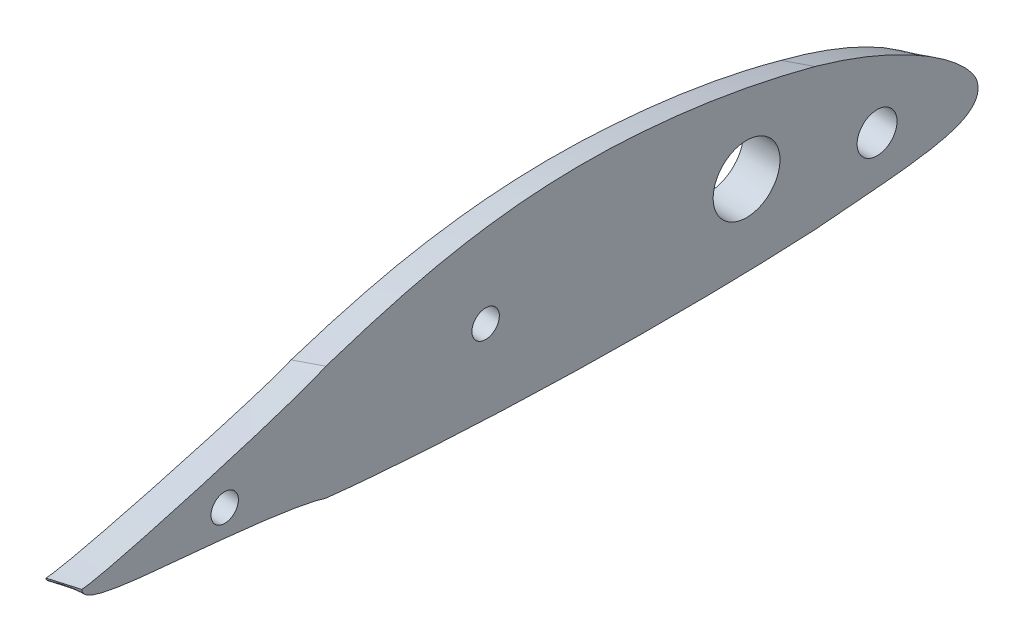
ISO-10303-21;
HEADER;
FILE_DESCRIPTION(('STEP AP214'),'2;1');
FILE_NAME('part.step','',(''),(''),'','','');
FILE_SCHEMA(('AUTOMOTIVE_DESIGN { 1 0 10303 214 1 1 1 1 }'));
ENDSEC;
DATA;
#1=APPLICATION_CONTEXT('core data for automotive mechanical design processes');
#2=APPLICATION_PROTOCOL_DEFINITION('international standard','automotive_design',2000,#1);
#3=PRODUCT_CONTEXT('',#1,'mechanical');
#4=PRODUCT('Part','Part','',(#3));
#5=PRODUCT_RELATED_PRODUCT_CATEGORY('part','',(#4));
#6=PRODUCT_DEFINITION_FORMATION('','',#4);
#7=PRODUCT_DEFINITION_CONTEXT('part definition',#1,'design');
#8=PRODUCT_DEFINITION('design','',#6,#7);
#9=PRODUCT_DEFINITION_SHAPE('','',#8);
#10=(LENGTH_UNIT() NAMED_UNIT(*) SI_UNIT(.MILLI.,.METRE.));
#11=(NAMED_UNIT(*) PLANE_ANGLE_UNIT() SI_UNIT($,.RADIAN.));
#12=(NAMED_UNIT(*) SI_UNIT($,.STERADIAN.) SOLID_ANGLE_UNIT());
#13=UNCERTAINTY_MEASURE_WITH_UNIT(LENGTH_MEASURE(1.E-05),#10,'distance_accuracy_value','');
#14=(GEOMETRIC_REPRESENTATION_CONTEXT(3) GLOBAL_UNCERTAINTY_ASSIGNED_CONTEXT((#13)) GLOBAL_UNIT_ASSIGNED_CONTEXT((#10,
#11,#12)) REPRESENTATION_CONTEXT('',''));
#15=CARTESIAN_POINT('',(0.,0.,0.));
#16=DIRECTION('',(0.,0.,1.));
#17=DIRECTION('',(1.,0.,0.));
#18=AXIS2_PLACEMENT_3D('',#15,#16,#17);
#19=CARTESIAN_POINT('',(-25.,-6.87523890885718,62.5215420335683));
#20=DIRECTION('',(1.,0.,0.));
#21=DIRECTION('',(0.,1.,0.));
#22=AXIS2_PLACEMENT_3D('',#19,#20,#21);
#23=PLANE('',#22);
#24=CARTESIAN_POINT('',(-24.9999999999992,5.5006500499004,35.5100000003707));
#25=DIRECTION('',(1.,0.,0.));
#26=DIRECTION('',(0.,1.,-1.19463882276146E-09));
#27=AXIS2_PLACEMENT_3D('',#24,#25,#26);
#28=ELLIPSE('',#27,5.12702641156756,5.12);
#29=CARTESIAN_POINT('',(-24.9999999999988,10.627676461468,35.5099999942458));
#30=VERTEX_POINT('',#29);
#31=EDGE_CURVE('E482',#30,#30,#28,.T.);
#32=ORIENTED_EDGE('',*,*,#31,.F.);
#33=EDGE_LOOP('',(#32));
#34=FACE_BOUND('',#33,.T.);
#35=CARTESIAN_POINT('',(-24.9999999999996,1.64402232390111,15.5000000003833));
#36=DIRECTION('',(1.,0.,0.));
#37=DIRECTION('',(0.,1.,-1.19463882276146E-09));
#38=AXIS2_PLACEMENT_3D('',#35,#36,#37);
#39=ELLIPSE('',#38,3.06419937878843,3.06);
#40=CARTESIAN_POINT('',(-24.9999999999993,4.70822170268954,15.4999999967227));
#41=VERTEX_POINT('',#40);
#42=EDGE_CURVE('E486',#41,#41,#39,.T.);
#43=ORIENTED_EDGE('',*,*,#42,.F.);
#44=EDGE_LOOP('',(#43));
#45=FACE_BOUND('',#44,.T.);
#46=CARTESIAN_POINT('',(-24.999999999999,6.28985118663691,75.5099999997319));
#47=DIRECTION('',(1.,0.,0.));
#48=DIRECTION('',(0.,1.,-1.19463882276146E-09));
#49=AXIS2_PLACEMENT_3D('',#46,#47,#48);
#50=ELLIPSE('',#49,2.10288192661951,2.1);
#51=CARTESIAN_POINT('',(-24.9999999999988,8.39273311325642,75.5099999972198));
#52=VERTEX_POINT('',#51);
#53=EDGE_CURVE('E490',#52,#52,#50,.T.);
#54=ORIENTED_EDGE('',*,*,#53,.F.);
#55=EDGE_LOOP('',(#54));
#56=FACE_BOUND('',#55,.T.);
#57=CARTESIAN_POINT('',(-24.9999999999992,1.88350126871129,115.509999996588));
#58=DIRECTION('',(1.,0.,0.));
#59=DIRECTION('',(0.,1.,-1.19463882276146E-09));
#60=AXIS2_PLACEMENT_3D('',#57,#58,#59);
#61=ELLIPSE('',#60,2.10288192661951,2.1);
#62=CARTESIAN_POINT('',(-24.999999999999,3.9863831953308,115.509999994075));
#63=VERTEX_POINT('',#62);
#64=EDGE_CURVE('E493',#63,#63,#61,.T.);
#65=ORIENTED_EDGE('',*,*,#64,.F.);
#66=EDGE_LOOP('',(#65));
#67=FACE_BOUND('',#66,.T.);
#68=CARTESIAN_POINT('',(-25.,-6.46727104194618,25.));
#69=CARTESIAN_POINT('',(-25.,-6.59514844057958,27.3335150436203));
#70=CARTESIAN_POINT('',(-25.,-6.76161802996523,31.2464802203529));
#71=CARTESIAN_POINT('',(-25.,-6.9275552680851,36.7458923067943));
#72=CARTESIAN_POINT('',(-25.,-7.01719182140762,42.1938583789044));
#73=CARTESIAN_POINT('',(-25.,-7.0464676153504,47.6734408847487));
#74=CARTESIAN_POINT('',(-25.,-7.03392510715627,56.2754783893999));
#75=CARTESIAN_POINT('',(-25.,-6.83729861053213,64.8634462694053));
#76=CARTESIAN_POINT('',(-25.,-6.43471319589367,75.7992808146063));
#77=CARTESIAN_POINT('',(-25.,-6.00320909266925,83.6044279292734));
#78=CARTESIAN_POINT('',(-25.,-5.40497674782844,92.1925983053741));
#79=CARTESIAN_POINT('',(-25.,-4.98326213169716,96.879208298821));
#80=CARTESIAN_POINT('',(-25.,-4.63536817981115,100.));
#81=B_SPLINE_CURVE_WITH_KNOTS('',3,(#68,#69,#70,#71,#72,#73,#74,#75,#76,#77,#78,#79,#80),
.UNSPECIFIED.,.F.,.F.,(4,1,1,1,1,1,1,1,1,1,4),(0.,0.09375,0.15625,0.21875,0.3125,0.375,0.5625,
0.65625,0.8125,0.875,1.),.UNSPECIFIED.);
#82=CARTESIAN_POINT('',(-25.,-6.46727104194618,25.));
#83=VERTEX_POINT('',#82);
#84=CARTESIAN_POINT('',(-25.,-4.63536817981115,100.));
#85=VERTEX_POINT('',#84);
#86=EDGE_CURVE('E207',#83,#85,#81,.T.);
#87=ORIENTED_EDGE('',*,*,#86,.F.);
#88=CARTESIAN_POINT('',(-25.,0.973605234190688,0.209986371700588));
#89=CARTESIAN_POINT('',(-25.,-5.02445676994703,-1.6030878994067));
#90=CARTESIAN_POINT('',(-25.,-5.12526387130145,10.1105981250928));
#91=CARTESIAN_POINT('',(-25.,-6.46727104194618,25.));
#92=B_SPLINE_CURVE_WITH_KNOTS('',3,(#88,#89,#90,#91),.UNSPECIFIED.,.F.,.F.,(4,4),(0.,1.),.UNSPECIFIED.);
#93=CARTESIAN_POINT('',(-25.,0.973605234190688,0.209986371700588));
#94=VERTEX_POINT('',#93);
#95=EDGE_CURVE('E13',#94,#83,#92,.T.);
#96=ORIENTED_EDGE('',*,*,#95,.F.);
#97=CARTESIAN_POINT('',(-25.,15.1870413329445,25.));
#98=CARTESIAN_POINT('',(-25.,11.2505460282975,10.9514941148119));
#99=CARTESIAN_POINT('',(-25.,4.68854762700634,1.64521557231438));
#100=CARTESIAN_POINT('',(-25.,0.973605234190688,0.209986371700588));
#101=B_SPLINE_CURVE_WITH_KNOTS('',3,(#97,#98,#99,#100),.UNSPECIFIED.,.F.,.F.,(4,4),(0.,1.),.UNSPECIFIED.);
#102=CARTESIAN_POINT('',(-25.,15.1870413329445,25.));
#103=VERTEX_POINT('',#102);
#104=EDGE_CURVE('E156',#103,#94,#101,.T.);
#105=ORIENTED_EDGE('',*,*,#104,.F.);
#106=CARTESIAN_POINT('',(-25.,12.8904914199755,100.));
#107=CARTESIAN_POINT('',(-25.,13.9017198457086,96.9217701257834));
#108=CARTESIAN_POINT('',(-25.,15.3529910442084,92.2723434802091));
#109=CARTESIAN_POINT('',(-25.,17.5611954251861,83.9333529161477));
#110=CARTESIAN_POINT('',(-25.,18.6223359111329,78.4097667119618));
#111=CARTESIAN_POINT('',(-25.,19.4717543578297,72.1307352650264));
#112=CARTESIAN_POINT('',(-25.,20.1811537589977,64.8415809888238));
#113=CARTESIAN_POINT('',(-25.,20.1301122581371,56.8127468678325));
#114=CARTESIAN_POINT('',(-25.,19.6578895305848,50.5374588378752));
#115=CARTESIAN_POINT('',(-25.,19.2942750671242,46.6091887363925));
#116=CARTESIAN_POINT('',(-25.,18.7483182972898,42.1560687549081));
#117=CARTESIAN_POINT('',(-25.,17.8299711544026,36.6680529799144));
#118=CARTESIAN_POINT('',(-25.,16.7438634166486,31.1887225621732));
#119=CARTESIAN_POINT('',(-25.,15.8028667331017,27.3087481175205));
#120=CARTESIAN_POINT('',(-25.,15.1870413329445,25.));
#121=B_SPLINE_CURVE_WITH_KNOTS('',3,(#106,#107,#108,#109,#110,#111,#112,#113,#114,#115,#116,
#117,#118,#119,#120),.UNSPECIFIED.,.F.,.F.,(4,1,1,1,1,1,1,1,1,1,1,1,4),(0.,0.125,0.1875,
0.333569716721123,0.34375,0.4375,0.625,0.666941593847408,0.6875,0.78125,0.84375,0.90625,1.),.UNSPECIFIED.);
#122=CARTESIAN_POINT('',(-25.,12.8904914199755,100.));
#123=VERTEX_POINT('',#122);
#124=EDGE_CURVE('E439',#123,#103,#121,.T.);
#125=ORIENTED_EDGE('',*,*,#124,.F.);
#126=CARTESIAN_POINT('',(-25.,1.96131753405757,137.419360993401));
#127=CARTESIAN_POINT('',(-25.,2.17769518252344,133.342560592737));
#128=CARTESIAN_POINT('',(-25.,10.5653288693064,104.537660694706));
#129=CARTESIAN_POINT('',(-25.,12.8904914199755,100.));
#130=B_SPLINE_CURVE_WITH_KNOTS('',3,(#126,#127,#128,#129),.UNSPECIFIED.,.F.,.F.,(4,4),(0.,1.),.UNSPECIFIED.);
#131=CARTESIAN_POINT('',(-25.,1.96131753405757,137.419360993401));
#132=VERTEX_POINT('',#131);
#133=EDGE_CURVE('E321',#132,#123,#130,.T.);
#134=ORIENTED_EDGE('',*,*,#133,.F.);
#135=CARTESIAN_POINT('',(-25.,-4.63536817981115,100.));
#136=CARTESIAN_POINT('',(-25.,-4.12984221570328,101.448294677224));
#137=CARTESIAN_POINT('',(-25.,-2.96356299158403,107.679495801348));
#138=CARTESIAN_POINT('',(-25.,-1.62946195542815,121.235381181294));
#139=CARTESIAN_POINT('',(-25.,-0.557970232798628,133.508903021512));
#140=CARTESIAN_POINT('',(-25.,0.772229147088015,137.377579987367));
#141=CARTESIAN_POINT('',(-25.,1.96131753405757,137.419360993401));
#142=B_SPLINE_CURVE_WITH_KNOTS('',3,(#135,#136,#137,#138,#139,#140,#141),.UNSPECIFIED.,.F.,.F.,
(4,1,1,1,4),(0.,0.25,0.5,0.75,1.),.UNSPECIFIED.);
#143=EDGE_CURVE('E373',#85,#132,#142,.T.);
#144=ORIENTED_EDGE('',*,*,#143,.F.);
#145=EDGE_LOOP('',(#87,#96,#105,#125,#134,#144));
#146=FACE_BOUND('',#145,.T.);
#147=ADVANCED_FACE('F146',(#34,#45,#56,#67,#146),#23,.T.);
#148=CARTESIAN_POINT('',(-30.9940646990496,-1.37215374510614,118.708278387877));
#149=DIRECTION('',(-0.998629534743233,0.0523359564593458,-6.25186067476628E-11));
#150=DIRECTION('',(-0.0523359564593458,-0.998629534743233,0.));
#151=AXIS2_PLACEMENT_3D('',#148,#149,#150);
#152=PLANE('',#151);
#153=CARTESIAN_POINT('',(-30.618444825927,5.79510026747242,35.510000000019));
#154=DIRECTION('',(-0.998629534743233,0.0523359564593458,-6.25186067476628E-11));
#155=DIRECTION('',(-0.0523359564593458,-0.998629534743233,0.));
#156=AXIS2_PLACEMENT_3D('',#153,#154,#155);
#157=CIRCLE('',#156,5.12);
#158=CARTESIAN_POINT('',(-30.8864049229988,0.682117049587073,35.510000000019));
#159=VERTEX_POINT('',#158);
#160=EDGE_CURVE('E601',#159,#159,#157,.T.);
#161=ORIENTED_EDGE('',*,*,#160,.F.);
#162=EDGE_LOOP('',(#161));
#163=FACE_BOUND('',#162,.T.);
#164=CARTESIAN_POINT('',(-30.8200085103059,1.94903604659932,15.500000000019));
#165=DIRECTION('',(-0.998629534743233,0.0523359564593458,-6.25186067476628E-11));
#166=DIRECTION('',(-0.0523359564593458,-0.998629534743233,0.));
#167=AXIS2_PLACEMENT_3D('',#164,#165,#166);
#168=CIRCLE('',#167,3.06);
#169=CARTESIAN_POINT('',(-30.9801565370715,-1.10677032971498,15.500000000019));
#170=VERTEX_POINT('',#169);
#171=EDGE_CURVE('E602',#170,#170,#168,.T.);
#172=ORIENTED_EDGE('',*,*,#171,.F.);
#173=EDGE_LOOP('',(#172));
#174=FACE_BOUND('',#173,.T.);
#175=CARTESIAN_POINT('',(-30.5771978372381,6.58213974112068,75.5099999993828));
#176=DIRECTION('',(-0.998629534743233,0.0523359564593458,-6.25186067476628E-11));
#177=DIRECTION('',(-0.0523359564593458,-0.998629534743233,0.));
#178=AXIS2_PLACEMENT_3D('',#175,#176,#177);
#179=CIRCLE('',#178,2.1);
#180=CARTESIAN_POINT('',(-30.6871033458028,4.48501771815989,75.5099999993828));
#181=VERTEX_POINT('',#180);
#182=EDGE_CURVE('E591',#181,#181,#179,.T.);
#183=ORIENTED_EDGE('',*,*,#182,.F.);
#184=EDGE_LOOP('',(#183));
#185=FACE_BOUND('',#184,.T.);
#186=CARTESIAN_POINT('',(-30.8074923334552,2.18785904637295,115.509999996224));
#187=DIRECTION('',(-0.998629534743233,0.0523359564593458,-6.25186067476628E-11));
#188=DIRECTION('',(-0.0523359564593458,-0.998629534743233,0.));
#189=AXIS2_PLACEMENT_3D('',#186,#187,#188);
#190=CIRCLE('',#189,2.1);
#191=CARTESIAN_POINT('',(-30.9173978420198,0.0907370234121542,115.509999996224));
#192=VERTEX_POINT('',#191);
#193=EDGE_CURVE('E594',#192,#192,#190,.T.);
#194=ORIENTED_EDGE('',*,*,#193,.F.);
#195=EDGE_LOOP('',(#194));
#196=FACE_BOUND('',#195,.T.);
#197=CARTESIAN_POINT('',(-31.0430922171337,-2.30765453758993,100.));
#198=CARTESIAN_POINT('',(-31.0405888672822,-2.25988777663054,100.387571370376));
#199=CARTESIAN_POINT('',(-31.0385119866042,-2.22025853223121,100.775962419935));
#200=CARTESIAN_POINT('',(-31.034612804975,-2.14585771397358,101.55323382453));
#201=CARTESIAN_POINT('',(-31.0328238002538,-2.11172147003079,101.942205345746));
#202=CARTESIAN_POINT('',(-31.0277548977915,-2.01500104829763,103.109449228744));
#203=CARTESIAN_POINT('',(-31.0247728156235,-1.95809953014157,103.888077041598));
#204=CARTESIAN_POINT('',(-31.0166047235201,-1.8022430460934,106.224871932533));
#205=CARTESIAN_POINT('',(-31.0122264000537,-1.71869965605326,107.783985053902));
#206=CARTESIAN_POINT('',(-31.0015555983983,-1.51508862635474,112.46421069925));
#207=CARTESIAN_POINT('',(-30.9972648556404,-1.43321637391091,115.586080001787));
#208=CARTESIAN_POINT('',(-30.9924646207543,-1.34162243070374,120.269377580922));
#209=CARTESIAN_POINT('',(-30.9912460999377,-1.3183716666778,121.830656945481));
#210=CARTESIAN_POINT('',(-30.9888938329408,-1.2734877350425,124.953255705198));
#211=CARTESIAN_POINT('',(-30.9877497450413,-1.25165723567519,126.514580261228));
#212=CARTESIAN_POINT('',(-30.9848488152157,-1.19630419458495,128.856133164177));
#213=CARTESIAN_POINT('',(-30.9836803499547,-1.17400854838672,129.636527523433));
#214=CARTESIAN_POINT('',(-30.9804898397006,-1.11312998451311,131.196794003637));
#215=CARTESIAN_POINT('',(-30.9785047780215,-1.07525275050715,131.976670930877));
#216=CARTESIAN_POINT('',(-30.9740763386401,-0.990753092312241,133.144754822464));
#217=CARTESIAN_POINT('',(-30.9723496098295,-0.957805143526188,133.533773789068));
#218=CARTESIAN_POINT('',(-30.9679703995469,-0.874244832958121,134.30995257949));
#219=CARTESIAN_POINT('',(-30.9653447538219,-0.824144527732533,134.697344223543));
#220=CARTESIAN_POINT('',(-30.9599479999923,-0.721168329976943,135.27376736968));
#221=CARTESIAN_POINT('',(-30.9579009353132,-0.682108008959784,135.465171861675));
#222=CARTESIAN_POINT('',(-30.9529733893552,-0.588084830937332,135.843918077059));
#223=CARTESIAN_POINT('',(-30.9501052741016,-0.53335793174868,136.03184311131));
#224=CARTESIAN_POINT('',(-30.9427770696627,-0.393527461320893,136.395083969518));
#225=CARTESIAN_POINT('',(-30.9383638609231,-0.309318422264135,136.574153668947));
#226=CARTESIAN_POINT('',(-30.9287325263111,-0.125541610533196,136.803263628492));
#227=CARTESIAN_POINT('',(-30.9250229121406,-0.0547579556999206,136.871643763586));
#228=CARTESIAN_POINT('',(-30.9161452343838,0.114638226466441,136.971573672684));
#229=CARTESIAN_POINT('',(-30.9111027596621,0.210854375510566,136.999166459119));
#230=CARTESIAN_POINT('',(-30.9059320818603,0.309516785006777,137.));
#231=B_SPLINE_CURVE_WITH_KNOTS('',3,(#197,#198,#199,#200,#201,#202,#203,#204,#205,#206,#207,
#208,#209,#210,#211,#212,#213,#214,#215,#216,#217,#218,#219,#220,#221,#222,#223,#224,#225,#226,
#227,#228,#229,#230),.UNSPECIFIED.,.F.,.F.,(4,2,2,2,2,2,2,2,2,2,2,2,2,2,2,2,4),(0.,
0.0312499999999995,0.0624999999999991,0.124999999999999,0.250000000000001,0.500000000000004,
0.625000000000004,0.750000000000005,0.812500000000005,0.875000000000004,0.906250000000004,
0.937500000000003,0.953125000000002,0.968750000000001,0.984374999999999,0.9921875,1.),.UNSPECIFIED.);
#232=CARTESIAN_POINT('',(-31.0430922171337,-2.30765453758993,100.));
#233=VERTEX_POINT('',#232);
#234=CARTESIAN_POINT('',(-30.9059320818603,0.309516785006768,137.));
#235=VERTEX_POINT('',#234);
#236=EDGE_CURVE('E289',#233,#235,#231,.T.);
#237=ORIENTED_EDGE('',*,*,#236,.T.);
#238=CARTESIAN_POINT('',(-30.9059320818603,0.309516785006768,137.));
#239=CARTESIAN_POINT('',(-30.9055368501271,0.317058255456844,136.796608319332));
#240=CARTESIAN_POINT('',(-30.9043057559796,0.340548930824258,136.596440665329));
#241=CARTESIAN_POINT('',(-30.9014926531859,0.39422612904938,136.197458878768));
#242=CARTESIAN_POINT('',(-30.8998336058368,0.425882637920563,135.998941894195));
#243=CARTESIAN_POINT('',(-30.8944844793777,0.527950049914961,135.404825731228));
#244=CARTESIAN_POINT('',(-30.8904204599391,0.605496159532625,135.010668887805));
#245=CARTESIAN_POINT('',(-30.8775924361851,0.850269431795186,133.830651356376));
#246=CARTESIAN_POINT('',(-30.8681676103681,1.03010581978635,133.047339540177));
#247=CARTESIAN_POINT('',(-30.8388545300934,1.58943270613084,130.701410113554));
#248=CARTESIAN_POINT('',(-30.8178634755727,1.98996588314187,129.143572852775));
#249=CARTESIAN_POINT('',(-30.7531377685201,3.22500593594318,124.481867583631));
#250=CARTESIAN_POINT('',(-30.7074997192882,4.09583178419868,121.387728801896));
#251=CARTESIAN_POINT('',(-30.6131804816859,5.89555003435182,115.216167771568));
#252=CARTESIAN_POINT('',(-30.5644926472979,6.82456924981885,112.138782030795));
#253=CARTESIAN_POINT('',(-30.4878047427749,8.28786162677363,107.54278735239));
#254=CARTESIAN_POINT('',(-30.4616586015277,8.78675971787766,106.014270614859));
#255=CARTESIAN_POINT('',(-30.4204658759082,9.57276373998781,103.735527854569));
#256=CARTESIAN_POINT('',(-30.4064161236507,9.84084898122943,102.978155452533));
#257=CARTESIAN_POINT('',(-30.3842197287804,10.2643814226241,101.849866930561));
#258=CARTESIAN_POINT('',(-30.3766359577625,10.4090883929775,101.475051997465));
#259=CARTESIAN_POINT('',(-30.3606868702697,10.7134151093236,100.730835621208));
#260=CARTESIAN_POINT('',(-30.3524890229688,10.8698393531269,100.360274178101));
#261=CARTESIAN_POINT('',(-30.3428060033805,11.0546023722461,100.));
#262=B_SPLINE_CURVE_WITH_KNOTS('',3,(#238,#239,#240,#241,#242,#243,#244,#245,#246,#247,#248,
#249,#250,#251,#252,#253,#254,#255,#256,#257,#258,#259,#260,#261),.UNSPECIFIED.,.F.,.F.,(4,2,2,
2,2,2,2,2,2,2,2,4),(0.,0.015624999999999,0.0312499999999979,0.062499999999998,0.124999999999998,
0.249999999999998,0.499999999999999,0.75,0.875,0.9375,0.96875,1.),.UNSPECIFIED.);
#263=CARTESIAN_POINT('',(-30.3428060033805,11.0546023722461,100.));
#264=VERTEX_POINT('',#263);
#265=EDGE_CURVE('E281',#235,#264,#262,.T.);
#266=ORIENTED_EDGE('',*,*,#265,.T.);
#267=CARTESIAN_POINT('',(-30.3428060033805,11.0546023722461,100.));
#268=CARTESIAN_POINT('',(-30.2868563612065,12.1221851341158,96.9322533281964));
#269=CARTESIAN_POINT('',(-30.2085072298683,13.6171756068156,92.291985137274));
#270=CARTESIAN_POINT('',(-30.0884420444621,15.9081558012432,83.6971849551633));
#271=CARTESIAN_POINT('',(-30.0125122894403,17.3569818200314,75.7804617281611));
#272=CARTESIAN_POINT('',(-29.9577725554591,18.4014781489858,64.8361954549192));
#273=CARTESIAN_POINT('',(-29.9600220398568,18.3585554197134,56.3085673557943));
#274=CARTESIAN_POINT('',(-29.9955000995849,17.681593705108,47.6635880941875));
#275=CARTESIAN_POINT('',(-30.0292408966741,17.0377809399741,42.1467609712499));
#276=CARTESIAN_POINT('',(-30.0767030750949,16.1321486232158,36.6488807432505));
#277=CARTESIAN_POINT('',(-30.1344380159256,15.0305003235926,31.1744965464025));
#278=CARTESIAN_POINT('',(-30.1861922586034,14.0429705443545,27.302647893024));
#279=CARTESIAN_POINT('',(-30.220952153661,13.3797122355054,25.));
#280=B_SPLINE_CURVE_WITH_KNOTS('',3,(#267,#268,#269,#270,#271,#272,#273,#274,#275,#276,#277,
#278,#279),.UNSPECIFIED.,.F.,.F.,(4,1,1,1,1,1,1,1,1,1,4),(0.,0.125,0.1875,0.34375,0.4375,0.625,
0.6875,0.78125,0.84375,0.90625,1.),.UNSPECIFIED.);
#281=CARTESIAN_POINT('',(-30.2209521536492,13.3797122357301,25.));
#282=VERTEX_POINT('',#281);
#283=EDGE_CURVE('E288',#264,#282,#280,.T.);
#284=ORIENTED_EDGE('',*,*,#283,.T.);
#285=CARTESIAN_POINT('',(-30.2209521536492,13.3797122357301,25.));
#286=CARTESIAN_POINT('',(-30.2360665330655,13.0913126960277,23.9069928281534));
#287=CARTESIAN_POINT('',(-30.2524284480114,12.7791087604684,22.8211768855777));
#288=CARTESIAN_POINT('',(-30.2877608647862,12.1049260866965,20.6645818038492));
#289=CARTESIAN_POINT('',(-30.3067483404637,11.7426234681599,19.5929433795812));
#290=CARTESIAN_POINT('',(-30.3676913101732,10.5797623339953,16.4131151733036));
#291=CARTESIAN_POINT('',(-30.4135499291072,9.70472775894772,14.3366321597632));
#292=CARTESIAN_POINT('',(-30.492321691831,8.20167298988506,11.3047614109054));
#293=CARTESIAN_POINT('',(-30.5203217083668,7.66740084812574,10.3061142655404));
#294=CARTESIAN_POINT('',(-30.5801952829931,6.52494498910318,8.35719655750463));
#295=CARTESIAN_POINT('',(-30.6120326179864,5.91745244970262,7.40606845319041));
#296=CARTESIAN_POINT('',(-30.6639449580099,4.9269059963922,6.03039867920954));
#297=CARTESIAN_POINT('',(-30.6819796517282,4.58278354131777,5.5798333875021));
#298=CARTESIAN_POINT('',(-30.7196749026293,3.86351530833346,4.70815223459664));
#299=CARTESIAN_POINT('',(-30.7393383710088,3.48831398147862,4.28621424960424));
#300=CARTESIAN_POINT('',(-30.781148086248,2.69053709247026,3.48464673590407));
#301=CARTESIAN_POINT('',(-30.8032705125884,2.26841605289779,3.10390672120265));
#302=CARTESIAN_POINT('',(-30.839094100368,1.58486128006569,2.60530784838879));
#303=CARTESIAN_POINT('',(-30.8515476253812,1.34723386784442,2.45039955633066));
#304=CARTESIAN_POINT('',(-30.8778128767139,0.846063018781732,2.18234874389511));
#305=CARTESIAN_POINT('',(-30.8914153320993,0.586512709223841,2.07004208892214));
#306=CARTESIAN_POINT('',(-30.9059320734379,0.309516784545213,2.00000000001898));
#307=B_SPLINE_CURVE_WITH_KNOTS('',3,(#285,#286,#287,#288,#289,#290,#291,#292,#293,#294,#295,
#296,#297,#298,#299,#300,#301,#302,#303,#304,#305,#306),.UNSPECIFIED.,.F.,.F.,(4,2,2,2,2,2,2,2,
2,2,4),(0.,0.125,0.25,0.5,0.625,0.75,0.8125,0.875,0.9375,0.96875,1.),.UNSPECIFIED.);
#308=CARTESIAN_POINT('',(-30.9059320734379,0.309516784545213,2.00000000001898));
#309=VERTEX_POINT('',#308);
#310=EDGE_CURVE('E227',#282,#309,#307,.T.);
#311=ORIENTED_EDGE('',*,*,#310,.T.);
#312=CARTESIAN_POINT('',(-30.9059320734365,0.309516784571313,2.00000000001346));
#313=CARTESIAN_POINT('',(-30.9125017860627,0.184159200503921,2.0265097236331));
#314=CARTESIAN_POINT('',(-30.9187234124713,0.0654434971226595,2.06913990747394));
#315=CARTESIAN_POINT('',(-30.9305749653615,-0.160697602466682,2.18180289730611));
#316=CARTESIAN_POINT('',(-30.9362270269369,-0.26854536142169,2.2525171177577));
#317=CARTESIAN_POINT('',(-30.9517661779802,-0.565050024983014,2.48814850985323));
#318=CARTESIAN_POINT('',(-30.9606563100254,-0.734683848776912,2.68035349366256));
#319=CARTESIAN_POINT('',(-30.9762130822765,-1.03152474480303,3.08882119932063));
#320=CARTESIAN_POINT('',(-30.9829066167109,-1.15924498948343,3.30533768641629));
#321=CARTESIAN_POINT('',(-30.9950377099369,-1.39072003600797,3.75259075133175));
#322=CARTESIAN_POINT('',(-31.0004738819693,-1.49444837691044,3.98435917167242));
#323=CARTESIAN_POINT('',(-31.0153031264911,-1.77740721659793,4.68476750698042));
#324=CARTESIAN_POINT('',(-31.0233416414315,-1.93079121773895,5.16072604035349));
#325=CARTESIAN_POINT('',(-31.0375696873338,-2.20227850412898,6.12166927173714));
#326=CARTESIAN_POINT('',(-31.0437131767197,-2.31950326377605,6.60687873040012));
#327=CARTESIAN_POINT('',(-31.060344861304,-2.63685470761402,8.07128820826406));
#328=CARTESIAN_POINT('',(-31.0690815234247,-2.80356014986264,9.06047441358479));
#329=CARTESIAN_POINT('',(-31.084159506197,-3.09126519655822,11.0428311861838));
#330=CARTESIAN_POINT('',(-31.0904481467589,-3.21125960501708,12.0360067257797));
#331=CARTESIAN_POINT('',(-31.107091196657,-3.52882791014887,15.0190838806501));
#332=CARTESIAN_POINT('',(-31.1152719917049,-3.68492677564576,17.0124573542679));
#333=CARTESIAN_POINT('',(-31.1290043791062,-3.94695633084847,21.0034038595205));
#334=CARTESIAN_POINT('',(-31.1344768488934,-4.05137727206037,23.0011032715973));
#335=CARTESIAN_POINT('',(-31.1391997190062,-4.14149499948288,25.0000000000077));
#336=B_SPLINE_CURVE_WITH_KNOTS('',3,(#312,#313,#314,#315,#316,#317,#318,#319,#320,#321,#322,
#323,#324,#325,#326,#327,#328,#329,#330,#331,#332,#333,#334,#335),.UNSPECIFIED.,.F.,.F.,(4,2,2,
2,2,2,2,2,2,2,2,4),(0.,0.015625,0.0312500000000001,0.0625000000000001,0.0937500000000002,0.125,
0.1875,0.25,0.375,0.5,0.75,1.),.UNSPECIFIED.);
#337=CARTESIAN_POINT('',(-31.1391997190062,-4.14149499948288,25.0000000000077));
#338=VERTEX_POINT('',#337);
#339=EDGE_CURVE('E203',#309,#338,#336,.T.);
#340=ORIENTED_EDGE('',*,*,#339,.T.);
#341=CARTESIAN_POINT('',(-31.1391997190151,-4.14149499965263,25.));
#342=CARTESIAN_POINT('',(-31.1430430044371,-4.21482925103832,27.325305096942));
#343=CARTESIAN_POINT('',(-31.1493019262991,-4.33425658945246,31.2273342313834));
#344=CARTESIAN_POINT('',(-31.1579651030278,-4.4995598415217,36.7200894792421));
#345=CARTESIAN_POINT('',(-31.1645137064708,-4.62451463189443,42.1813315600029));
#346=CARTESIAN_POINT('',(-31.1681694759834,-4.69427086407652,46.6183041293754));
#347=CARTESIAN_POINT('',(-31.1696969766129,-4.72341730758226,50.5350843338448));
#348=CARTESIAN_POINT('',(-31.170381284993,-4.73647468178917,56.7969338044924));
#349=CARTESIAN_POINT('',(-31.1614114671015,-4.56532035162532,64.85619818432));
#350=CARTESIAN_POINT('',(-31.1456188094465,-4.26397848479534,72.142339747397));
#351=CARTESIAN_POINT('',(-31.128822439987,-3.94348465713868,78.3999568276506));
#352=CARTESIAN_POINT('',(-31.10984505844,-3.58137464081677,83.8834932107559));
#353=CARTESIAN_POINT('',(-31.0784467136676,-2.98225852497507,92.219032899259));
#354=CARTESIAN_POINT('',(-31.0581773167011,-2.59549538690137,96.8933170472572));
#355=CARTESIAN_POINT('',(-31.0430922171337,-2.30765453758993,100.));
#356=B_SPLINE_CURVE_WITH_KNOTS('',3,(#341,#342,#343,#344,#345,#346,#347,#348,#349,#350,#351,
#352,#353,#354,#355),.UNSPECIFIED.,.F.,.F.,(4,1,1,1,1,1,1,1,1,1,1,1,4),(0.,0.09375,0.15625,
0.21875,0.3125,0.333058406152592,0.375,0.5625,0.65625,0.666430283278877,0.8125,0.875,1.),.UNSPECIFIED.);
#357=EDGE_CURVE('E211',#338,#233,#356,.T.);
#358=ORIENTED_EDGE('',*,*,#357,.T.);
#359=EDGE_LOOP('',(#237,#266,#284,#311,#340,#358));
#360=FACE_BOUND('',#359,.T.);
#361=ADVANCED_FACE('F225',(#163,#174,#185,#196,#360),#152,.T.);
#362=CARTESIAN_POINT('',(-30.9059320734379,0.309516784545213,2.00000000001898));
#363=CARTESIAN_POINT('',(-25.,0.973605234190688,0.209986371700588));
#364=CARTESIAN_POINT('',(-30.8914153320993,0.586512709223841,2.07004208892214));
#365=CARTESIAN_POINT('',(-25.,1.08969718396618,0.254837284219769));
#366=CARTESIAN_POINT('',(-30.8778128767139,0.846063018781732,2.18234874389511));
#367=CARTESIAN_POINT('',(-25.,1.20856946187494,0.307374768361883));
#368=CARTESIAN_POINT('',(-30.8515476253812,1.34723386784442,2.45039955633066));
#369=CARTESIAN_POINT('',(-25.,1.45154065545896,0.427631911752379));
#370=CARTESIAN_POINT('',(-30.839094100368,1.58486128006569,2.60530784838879));
#371=CARTESIAN_POINT('',(-25.,1.57563957113421,0.495351571000761));
#372=CARTESIAN_POINT('',(-30.8032705125884,2.26841605289779,3.10390672120265));
#373=CARTESIAN_POINT('',(-25.,1.95527524705959,0.720997359195908));
#374=CARTESIAN_POINT('',(-30.781148086248,2.69053709247026,3.48464673590407));
#375=CARTESIAN_POINT('',(-25.,2.21815093620935,0.901410298592676));
#376=CARTESIAN_POINT('',(-30.7393383710088,3.48831398147862,4.28621424960424));
#377=CARTESIAN_POINT('',(-25.,2.76080064357398,1.32067326013609));
#378=CARTESIAN_POINT('',(-30.7196749026293,3.86351530833346,4.70815223459664));
#379=CARTESIAN_POINT('',(-25.,3.04057466178885,1.55952328228274));
#380=CARTESIAN_POINT('',(-30.6819796517282,4.58278354131777,5.5798333875021));
#381=CARTESIAN_POINT('',(-25.,3.61434887928318,2.09413266420912));
#382=CARTESIAN_POINT('',(-30.6639449580099,4.9269059963922,6.03039867920954));
#383=CARTESIAN_POINT('',(-25.,3.90834907856263,2.38989202398885));
#384=CARTESIAN_POINT('',(-30.6120326179864,5.91745244970262,7.40606845319041));
#385=CARTESIAN_POINT('',(-25.,4.80768072599702,3.36024249210249));
#386=CARTESIAN_POINT('',(-30.5801952829931,6.52494498910318,8.35719655750463));
#387=CARTESIAN_POINT('',(-25.,5.43034322374801,4.11790598921083));
#388=CARTESIAN_POINT('',(-30.5203217083668,7.66740084812574,10.3061142655404));
#389=CARTESIAN_POINT('',(-25.,6.70050716750172,5.84253739255835));
#390=CARTESIAN_POINT('',(-30.492321691831,8.20167298988506,11.3047614109054));
#391=CARTESIAN_POINT('',(-25.,7.34800861350445,6.80950529879751));
#392=CARTESIAN_POINT('',(-30.4135499291072,9.70472775894772,14.3366321597632));
#393=CARTESIAN_POINT('',(-25.,9.29570559788367,10.0060326898097));
#394=CARTESIAN_POINT('',(-30.3676913101732,10.5797623339953,16.4131151733036));
#395=CARTESIAN_POINT('',(-25.,10.6010937826312,12.5312158468775));
#396=CARTESIAN_POINT('',(-30.3067483404637,11.7426234681599,19.5929433795812));
#397=CARTESIAN_POINT('',(-25.,12.4412982484684,16.8369061614625));
#398=CARTESIAN_POINT('',(-30.2877608647862,12.1049260866965,20.6645818038492));
#399=CARTESIAN_POINT('',(-25.,13.0350534352001,18.358455529488));
#400=CARTESIAN_POINT('',(-30.2524284480114,12.7791087604684,22.8211768855777));
#401=CARTESIAN_POINT('',(-25.,14.1618940208977,21.5619708309325));
#402=CARTESIAN_POINT('',(-30.2360665330655,13.0913126960277,23.9069928281534));
#403=CARTESIAN_POINT('',(-25.,14.6949794198636,23.2439367643515));
#404=CARTESIAN_POINT('',(-30.2209521536492,13.3797122357301,25.));
#405=CARTESIAN_POINT('',(-25.,15.1870413329445,25.));
#406=B_SPLINE_SURFACE_WITH_KNOTS('',3,1,((#362,#363),(#364,#365),(#366,#367),(#368,#369),(#370,
#371),(#372,#373),(#374,#375),(#376,#377),(#378,#379),(#380,#381),(#382,#383),(#384,#385),(#386,
#387),(#388,#389),(#390,#391),(#392,#393),(#394,#395),(#396,#397),(#398,#399),(#400,#401),(#402,
#403),(#404,#405)),.UNSPECIFIED.,.F.,.F.,.F.,(4,2,2,2,2,2,2,2,2,2,4),(2,2),(0.,0.03125,0.0625,
0.125,0.1875,0.25,0.375,0.5,0.75,0.875,1.),(0.,1.),.UNSPECIFIED.);
#407=DIRECTION('',(0.944981797239758,0.32712291709007,0.));
#408=VECTOR('',#407,1.);
#409=CARTESIAN_POINT('',(-27.6104760768246,14.2833767843373,25.));
#410=LINE('',#409,#408);
#411=EDGE_CURVE('E312',#282,#103,#410,.T.);
#412=DIRECTION('',(-0.951515833977009,-0.106992540236089,0.288392465270621));
#413=VECTOR('',#412,1.);
#414=CARTESIAN_POINT('',(-27.952966036719,0.641561009367951,1.10499318585978));
#415=LINE('',#414,#413);
#416=EDGE_CURVE('E219',#94,#309,#415,.T.);
#417=ORIENTED_EDGE('',*,*,#310,.F.);
#418=ORIENTED_EDGE('',*,*,#411,.T.);
#419=ORIENTED_EDGE('',*,*,#104,.T.);
#420=ORIENTED_EDGE('',*,*,#416,.T.);
#421=EDGE_LOOP('',(#417,#418,#419,#420));
#422=FACE_BOUND('',#421,.T.);
#423=ADVANCED_FACE('F247',(#422),#406,.T.);
#424=CARTESIAN_POINT('',(-30.220952153661,13.3797122355054,25.));
#425=CARTESIAN_POINT('',(-25.,15.1870413329445,25.));
#426=CARTESIAN_POINT('',(-30.1861922586034,14.0429705443545,27.302647893024));
#427=CARTESIAN_POINT('',(-25.,15.8028667331017,27.3087481175205));
#428=CARTESIAN_POINT('',(-30.1344380159256,15.0305003235926,31.1744965464025));
#429=CARTESIAN_POINT('',(-25.,16.7438634166486,31.1887225621732));
#430=CARTESIAN_POINT('',(-30.0767030750949,16.1321486232158,36.6488807432505));
#431=CARTESIAN_POINT('',(-25.,17.8299711544026,36.6680529799144));
#432=CARTESIAN_POINT('',(-30.0292408966741,17.0377809399741,42.1467609712499));
#433=CARTESIAN_POINT('',(-25.,18.7483182972898,42.1560687549081));
#434=CARTESIAN_POINT('',(-30.0019693238482,17.5581535519239,46.6058302769687));
#435=CARTESIAN_POINT('',(-25.,19.2942750671242,46.6091887363925));
#436=CARTESIAN_POINT('',(-29.9837024546077,17.9067061840109,50.5383336959809));
#437=CARTESIAN_POINT('',(-25.,19.6578895305848,50.5374588378752));
#438=CARTESIAN_POINT('',(-29.95988750658,18.3611224681543,56.8185730051909));
#439=CARTESIAN_POINT('',(-25.,20.1301122581371,56.8127468678325));
#440=CARTESIAN_POINT('',(-29.9577725554591,18.4014781489858,64.8361954549192));
#441=CARTESIAN_POINT('',(-25.,20.1811537589977,64.8415809888238));
#442=CARTESIAN_POINT('',(-29.9942361353008,17.7057116094865,72.1264597298686));
#443=CARTESIAN_POINT('',(-25.,19.4717543578297,72.1307352650264));
#444=CARTESIAN_POINT('',(-30.0377647724762,16.8751357446571,78.4133810485541));
#445=CARTESIAN_POINT('',(-25.,18.6223359111329,78.4097667119618));
#446=CARTESIAN_POINT('',(-30.0919978192966,15.8403075761797,83.9517231386666));
#447=CARTESIAN_POINT('',(-25.,17.5611954251861,83.9333529161477));
#448=CARTESIAN_POINT('',(-30.2085072298683,13.6171756068156,92.291985137274));
#449=CARTESIAN_POINT('',(-25.,15.3529910442084,92.2723434802091));
#450=CARTESIAN_POINT('',(-30.2868563612065,12.1221851341158,96.9322533281964));
#451=CARTESIAN_POINT('',(-25.,13.9017198457086,96.9217701257834));
#452=CARTESIAN_POINT('',(-30.3428060033805,11.0546023722461,100.));
#453=CARTESIAN_POINT('',(-25.,12.8904914199755,100.));
#454=B_SPLINE_SURFACE_WITH_KNOTS('',3,1,((#424,#425),(#426,#427),(#428,#429),(#430,#431),(#432,
#433),(#434,#435),(#436,#437),(#438,#439),(#440,#441),(#442,#443),(#444,#445),(#446,#447),(#448,
#449),(#450,#451),(#452,#453)),.UNSPECIFIED.,.F.,.F.,.F.,(4,1,1,1,1,1,1,1,1,1,1,1,4),(2,2),(0.,
0.09375,0.15625,0.21875,0.3125,0.333058406152592,0.375,0.5625,0.65625,0.666430283278877,0.8125,
0.875,1.),(0.,1.),.UNSPECIFIED.);
#455=DIRECTION('',(0.945724712595379,0.324968872334548,0.));
#456=VECTOR('',#455,1.);
#457=CARTESIAN_POINT('',(-27.6714030016903,11.9725468961108,100.));
#458=LINE('',#457,#456);
#459=EDGE_CURVE('E310',#264,#123,#458,.T.);
#460=ORIENTED_EDGE('',*,*,#283,.F.);
#461=ORIENTED_EDGE('',*,*,#459,.T.);
#462=ORIENTED_EDGE('',*,*,#124,.T.);
#463=ORIENTED_EDGE('',*,*,#411,.F.);
#464=EDGE_LOOP('',(#460,#461,#462,#463));
#465=FACE_BOUND('',#464,.T.);
#466=ADVANCED_FACE('F308',(#465),#454,.T.);
#467=CARTESIAN_POINT('',(-31.1391997190062,-4.14149499948288,25.0000000000077));
#468=CARTESIAN_POINT('',(-25.,-6.46727104194618,25.));
#469=CARTESIAN_POINT('',(-31.1344768488934,-4.05137727206037,23.0011032715973));
#470=CARTESIAN_POINT('',(-25.,-6.25625812941599,22.6588381014781));
#471=CARTESIAN_POINT('',(-31.1290043791062,-3.94695633084847,21.0034038595205));
#472=CARTESIAN_POINT('',(-25.,-6.07031444186612,20.3155097300161));
#473=CARTESIAN_POINT('',(-31.1218191333373,-3.80985367725744,18.9152067636369));
#474=CARTESIAN_POINT('',(-25.0000000000001,-5.86773446867523,17.8638320698492));
#475=CARTESIAN_POINT('',(-31.1150173339879,-3.68006761702593,16.9559751198696));
#476=CARTESIAN_POINT('',(-25.0000000000001,-5.67730776307613,15.5634791363704));
#477=CARTESIAN_POINT('',(-31.1067262665243,-3.52186462850043,14.9627777815527));
#478=CARTESIAN_POINT('',(-25.0000000000001,-5.47437307578013,13.2213166012225));
#479=CARTESIAN_POINT('',(-31.0961968104341,-3.32095064069191,13.0663892209089));
#480=CARTESIAN_POINT('',(-25.0000000000001,-5.21528004238924,10.9943218845444));
#481=CARTESIAN_POINT('',(-31.0904481467589,-3.21125960501708,12.0360067257797));
#482=CARTESIAN_POINT('',(-25.0000000000001,-5.07378094992987,9.78433085284814));
#483=CARTESIAN_POINT('',(-31.084159506197,-3.09126519655822,11.0428311861838));
#484=CARTESIAN_POINT('',(-25.0000000000001,-4.91811103453904,8.61861646689018));
#485=CARTESIAN_POINT('',(-31.0725834950473,-2.87038174824309,9.52089125238124));
#486=CARTESIAN_POINT('',(-25.0000000000001,-4.60379405286719,6.84155073261075));
#487=CARTESIAN_POINT('',(-31.0644031684774,-2.71429182064151,8.53077964989564));
#488=CARTESIAN_POINT('',(-25.0000000000001,-4.3728360369825,5.68870802416582));
#489=CARTESIAN_POINT('',(-31.0544075118692,-2.52356333257868,7.54850828530049));
#490=CARTESIAN_POINT('',(-25.0000000000001,-4.07682722635806,4.54768001673797));
#491=CARTESIAN_POINT('',(-31.0439943433472,-2.32486824257679,6.63163527698877));
#492=CARTESIAN_POINT('',(-25.,-3.74233456632578,3.49605967780861));
#493=CARTESIAN_POINT('',(-31.0378812632629,-2.20822372696606,6.14627736957497));
#494=CARTESIAN_POINT('',(-25.,-3.53352034532391,2.94705565487789));
#495=CARTESIAN_POINT('',(-31.0308164623219,-2.07341929567234,5.66556546734031));
#496=CARTESIAN_POINT('',(-25.,-3.27586815181277,2.41818674195317));
#497=CARTESIAN_POINT('',(-31.0244316913616,-1.95159060927774,5.23434655784388));
#498=CARTESIAN_POINT('',(-25.,-3.04228475054927,1.94458795304574));
#499=CARTESIAN_POINT('',(-31.0165348321953,-1.80090956131498,4.75769650504503));
#500=CARTESIAN_POINT('',(-25.,-2.73843652100531,1.43654571986584));
#501=CARTESIAN_POINT('',(-31.0069317760344,-1.61767233540639,4.28937557524381));
#502=CARTESIAN_POINT('',(-25.,-2.3391303410627,1.00297208898152));
#503=CARTESIAN_POINT('',(-31.0004738819693,-1.49444837691044,3.98435917167242));
#504=CARTESIAN_POINT('',(-25.,-2.06886907387399,0.729076317998671));
#505=CARTESIAN_POINT('',(-30.9950377099369,-1.39072003600797,3.75259075133175));
#506=CARTESIAN_POINT('',(-25.,-1.83846302576973,0.542720441440922));
#507=CARTESIAN_POINT('',(-30.9860871305846,-1.21993280905249,3.4225978996135));
#508=CARTESIAN_POINT('',(-25.,-1.46529622927422,0.324612265892552));
#509=CARTESIAN_POINT('',(-30.9830600244287,-1.16217218308907,3.31784012816459));
#510=CARTESIAN_POINT('',(-25.,-1.33992831008757,0.263031109922589));
#511=CARTESIAN_POINT('',(-30.9762937231892,-1.03306346505821,3.10214750304159));
#512=CARTESIAN_POINT('',(-25.,-1.06590092493633,0.155349714195712));
#513=CARTESIAN_POINT('',(-30.9725133499913,-0.960929647769403,2.99167886582795));
#514=CARTESIAN_POINT('',(-25.,-0.91836257176115,0.112998141805439));
#515=CARTESIAN_POINT('',(-30.9606563100254,-0.734683848776912,2.68035349366256));
#516=CARTESIAN_POINT('',(-25.,-0.482423497144136,0.0265375401856025));
#517=CARTESIAN_POINT('',(-30.9517661779802,-0.565050024983014,2.48814850985323));
#518=CARTESIAN_POINT('',(-25.,-0.187645110766564,0.0156822145397658));
#519=CARTESIAN_POINT('',(-30.9362270269369,-0.26854536142169,2.2525171177577));
#520=CARTESIAN_POINT('',(-25.,0.252822402461409,0.0525722597833141));
#521=CARTESIAN_POINT('',(-30.9305749653615,-0.160697602466682,2.18180289730611));
#522=CARTESIAN_POINT('',(-25.,0.399361562481004,0.0737311138165477));
#523=CARTESIAN_POINT('',(-30.9187234124713,0.0654434971226595,2.06913990747394));
#524=CARTESIAN_POINT('',(-25.,0.689390804330586,0.131169325392137));
#525=CARTESIAN_POINT('',(-30.9125017860627,0.184159200503921,2.0265097236331));
#526=CARTESIAN_POINT('',(-25.,0.832880886160575,0.167448682934493));
#527=CARTESIAN_POINT('',(-30.9059320734365,0.309516784571313,2.00000000001346));
#528=CARTESIAN_POINT('',(-25.,0.973605234190688,0.209986371700588));
#529=B_SPLINE_SURFACE_WITH_KNOTS('',3,1,((#467,#468),(#469,#470),(#471,#472),(#473,#474),(#475,
#476),(#477,#478),(#479,#480),(#481,#482),(#483,#484),(#485,#486),(#487,#488),(#489,#490),(#491,
#492),(#493,#494),(#495,#496),(#497,#498),(#499,#500),(#501,#502),(#503,#504),(#505,#506),(#507,
#508),(#509,#510),(#511,#512),(#513,#514),(#515,#516),(#517,#518),(#519,#520),(#521,#522),(#523,
#524),(#525,#526),(#527,#528)),.UNSPECIFIED.,.F.,.F.,.F.,(4,2,1,1,2,2,1,2,1,2,1,2,2,2,2,2,2,4),
(2,2),(0.,0.25,0.261616773506643,0.495471524666193,0.5,0.625,0.691935674097553,0.75,
0.809330222314497,0.8125,0.865423404436652,0.875,0.90625,0.921113833197072,0.9375,0.96875,
0.984375,1.),(0.,1.),.UNSPECIFIED.);
#530=DIRECTION('',(0.935143216711032,-0.354269903095569,0.));
#531=VECTOR('',#530,1.);
#532=CARTESIAN_POINT('',(-28.0695998595076,-5.30438302079941,25.));
#533=LINE('',#532,#531);
#534=EDGE_CURVE('E164',#338,#83,#533,.T.);
#535=ORIENTED_EDGE('',*,*,#339,.F.);
#536=ORIENTED_EDGE('',*,*,#416,.F.);
#537=ORIENTED_EDGE('',*,*,#95,.T.);
#538=ORIENTED_EDGE('',*,*,#534,.F.);
#539=EDGE_LOOP('',(#535,#536,#537,#538));
#540=FACE_BOUND('',#539,.T.);
#541=ADVANCED_FACE('F200',(#540),#529,.T.);
#542=CARTESIAN_POINT('',(-30.3428060033805,11.0546023722461,100.));
#543=CARTESIAN_POINT('',(-25.,12.8904914199755,100.));
#544=CARTESIAN_POINT('',(-30.3524890229688,10.8698393531269,100.360274178101));
#545=CARTESIAN_POINT('',(-25.,12.8178300902671,100.14180189671));
#546=CARTESIAN_POINT('',(-30.3606868702697,10.7134151093236,100.730835621208));
#547=CARTESIAN_POINT('',(-25.,12.7392483785898,100.307302269204));
#548=CARTESIAN_POINT('',(-30.3766359577625,10.4090883929775,101.475051997465));
#549=CARTESIAN_POINT('',(-25.,12.5711129490596,100.682709527608));
#550=CARTESIAN_POINT('',(-30.3842197287804,10.2643814226241,101.849866930561));
#551=CARTESIAN_POINT('',(-25.,12.4815592312068,100.892616413518));
#552=CARTESIAN_POINT('',(-30.4064161236507,9.84084898122943,102.978155452533));
#553=CARTESIAN_POINT('',(-25.,12.1977432050279,101.584461184141));
#554=CARTESIAN_POINT('',(-30.4204658759082,9.57276373998781,103.735527854569));
#555=CARTESIAN_POINT('',(-25.,11.9883260240816,102.12852318175));
#556=CARTESIAN_POINT('',(-30.4616586015277,8.78675971787766,106.014270614859));
#557=CARTESIAN_POINT('',(-25.,11.3098800839071,103.973320368313));
#558=CARTESIAN_POINT('',(-30.4878047427749,8.28786162677363,107.54278735239));
#559=CARTESIAN_POINT('',(-25.,10.7906569273433,105.486666751008));
#560=CARTESIAN_POINT('',(-30.5644926472979,6.82456924981885,112.138782030795));
#561=CARTESIAN_POINT('',(-25.,9.11561061347177,110.590068611348));
#562=CARTESIAN_POINT('',(-30.6131804816859,5.89555003435182,115.216167771568));
#563=CARTESIAN_POINT('',(-25.,7.84241061198411,114.743486801252));
#564=CARTESIAN_POINT('',(-30.7074997192882,4.09583178419868,121.387728801896));
#565=CARTESIAN_POINT('',(-25.,5.4278096653965,123.021519412681));
#566=CARTESIAN_POINT('',(-30.7531377685201,3.22500593594318,124.481867583631));
#567=CARTESIAN_POINT('',(-25.,4.28640872029655,127.146133834206));
#568=CARTESIAN_POINT('',(-30.8178634755727,1.98996588314187,129.143572852775));
#569=CARTESIAN_POINT('',(-25.,3.00675957558812,132.163124389414));
#570=CARTESIAN_POINT('',(-30.8388545300934,1.58943270613084,130.701410113554));
#571=CARTESIAN_POINT('',(-25.,2.6522852395089,133.640466061637));
#572=CARTESIAN_POINT('',(-30.8681676103681,1.03010581978635,133.047339540177));
#573=CARTESIAN_POINT('',(-25.,2.27038717620678,135.42045476935));
#574=CARTESIAN_POINT('',(-30.8775924361851,0.850269431795186,133.830651356376));
#575=CARTESIAN_POINT('',(-25.,2.16805672857552,135.941113705152));
#576=CARTESIAN_POINT('',(-30.8904204599391,0.605496159532625,135.010668887805));
#577=CARTESIAN_POINT('',(-25.,2.05722696390549,136.59515352978));
#578=CARTESIAN_POINT('',(-30.8944844793777,0.527950049914961,135.404825731228));
#579=CARTESIAN_POINT('',(-25.,2.02739469347829,136.792008708144));
#580=CARTESIAN_POINT('',(-30.8998336058368,0.425882637920563,135.998941894195));
#581=CARTESIAN_POINT('',(-25.,1.99396433285328,137.053311502306));
#582=CARTESIAN_POINT('',(-30.9014926531859,0.39422612904938,136.197458878768));
#583=CARTESIAN_POINT('',(-25.,1.98470722014757,137.134749104797));
#584=CARTESIAN_POINT('',(-30.9043057559796,0.340548930824258,136.596440665329));
#585=CARTESIAN_POINT('',(-25.,1.97007427112836,137.285923847214));
#586=CARTESIAN_POINT('',(-30.9055368501271,0.317058255456844,136.796608319332));
#587=CARTESIAN_POINT('',(-25.,1.96469843481485,137.35566098714));
#588=CARTESIAN_POINT('',(-30.9059320818603,0.309516785006768,137.));
#589=CARTESIAN_POINT('',(-25.,1.96131753405757,137.419360993401));
#590=B_SPLINE_SURFACE_WITH_KNOTS('',3,1,((#542,#543),(#544,#545),(#546,#547),(#548,#549),(#550,
#551),(#552,#553),(#554,#555),(#556,#557),(#558,#559),(#560,#561),(#562,#563),(#564,#565),(#566,
#567),(#568,#569),(#570,#571),(#572,#573),(#574,#575),(#576,#577),(#578,#579),(#580,#581),(#582,
#583),(#584,#585),(#586,#587),(#588,#589)),.UNSPECIFIED.,.F.,.F.,.F.,(4,2,2,2,2,2,2,2,2,2,2,4),
(2,2),(0.,0.0312499999999998,0.0624999999999996,0.125,0.25,0.500000000000001,0.750000000000002,
0.875000000000002,0.937500000000002,0.968750000000002,0.984375000000001,1.),(0.,1.),.UNSPECIFIED.);
#591=DIRECTION('',(0.960798928602013,0.268721070265358,0.0682232012783338));
#592=VECTOR('',#591,1.);
#593=CARTESIAN_POINT('',(-27.9529660409301,1.13541715953217,137.2096804967));
#594=LINE('',#593,#592);
#595=EDGE_CURVE('E323',#235,#132,#594,.T.);
#596=ORIENTED_EDGE('',*,*,#265,.F.);
#597=ORIENTED_EDGE('',*,*,#595,.T.);
#598=ORIENTED_EDGE('',*,*,#133,.T.);
#599=ORIENTED_EDGE('',*,*,#459,.F.);
#600=EDGE_LOOP('',(#596,#597,#598,#599));
#601=FACE_BOUND('',#600,.T.);
#602=ADVANCED_FACE('F317',(#601),#590,.T.);
#603=CARTESIAN_POINT('',(-30.9059320818603,0.309516785006777,137.));
#604=CARTESIAN_POINT('',(-25.,1.96131753405757,137.419360993401));
#605=CARTESIAN_POINT('',(-30.9111027596621,0.210854375510566,136.999166459119));
#606=CARTESIAN_POINT('',(-25.,1.92415852196477,137.418055336962));
#607=CARTESIAN_POINT('',(-30.9161452343838,0.114638226466441,136.971573672684));
#608=CARTESIAN_POINT('',(-25.,1.88751121758391,137.414901479863));
#609=CARTESIAN_POINT('',(-30.9250229121406,-0.0547579556999206,136.871643763586));
#610=CARTESIAN_POINT('',(-25.,1.81521743996837,137.404947055488));
#611=CARTESIAN_POINT('',(-30.9287325263111,-0.125541610533196,136.803263628492));
#612=CARTESIAN_POINT('',(-25.,1.77957096673369,137.398146488213));
#613=CARTESIAN_POINT('',(-30.9383638609231,-0.309318422264135,136.574153668947));
#614=CARTESIAN_POINT('',(-25.,1.67409891733238,137.372349257844));
#615=CARTESIAN_POINT('',(-30.9427770696627,-0.393527461320893,136.395083969518));
#616=CARTESIAN_POINT('',(-25.,1.60574071146847,137.347957066207));
#617=CARTESIAN_POINT('',(-30.9501052741016,-0.53335793174868,136.03184311131));
#618=CARTESIAN_POINT('',(-25.,1.47275661299298,137.285182135989));
#619=CARTESIAN_POINT('',(-30.9529733893552,-0.588084830937332,135.843918077059));
#620=CARTESIAN_POINT('',(-25.,1.40813072038139,137.246799397409));
#621=CARTESIAN_POINT('',(-30.9579009353132,-0.682108008959784,135.465171861675));
#622=CARTESIAN_POINT('',(-25.,1.28243057418896,137.156440902476));
#623=CARTESIAN_POINT('',(-30.9599479999923,-0.721168329976943,135.27376736968));
#624=CARTESIAN_POINT('',(-25.,1.22135632060811,137.104465146125));
#625=CARTESIAN_POINT('',(-30.9653447538219,-0.824144527732533,134.697344223543));
#626=CARTESIAN_POINT('',(-25.,1.04319000707925,136.928744644171));
#627=CARTESIAN_POINT('',(-30.9679703995469,-0.874244832958121,134.30995257949));
#628=CARTESIAN_POINT('',(-25.,0.931154394344958,136.785206665671));
#629=CARTESIAN_POINT('',(-30.9723496098295,-0.957805143526188,133.533773789068));
#630=CARTESIAN_POINT('',(-25.,0.719121634340162,136.448528987655));
#631=CARTESIAN_POINT('',(-30.9740763386401,-0.990753092312241,133.144754822464));
#632=CARTESIAN_POINT('',(-25.,0.619124487069661,136.255389288139));
#633=CARTESIAN_POINT('',(-30.9785047780215,-1.07525275050715,131.976670930877));
#634=CARTESIAN_POINT('',(-25.,0.335022652794712,135.606337958133));
#635=CARTESIAN_POINT('',(-30.9804898397006,-1.11312998451311,131.196794003637));
#636=CARTESIAN_POINT('',(-25.,0.166807573326818,135.080794096188));
#637=CARTESIAN_POINT('',(-30.9836803499547,-1.17400854838672,129.636527523433));
#638=CARTESIAN_POINT('',(-25.,-0.138813449026906,133.869462288779));
#639=CARTESIAN_POINT('',(-30.9848488152157,-1.19630419458495,128.856133164177));
#640=CARTESIAN_POINT('',(-25.,-0.276219391912722,133.183674343315));
#641=CARTESIAN_POINT('',(-30.9877497450413,-1.25165723567519,126.514580261228));
#642=CARTESIAN_POINT('',(-25.,-0.65956824097016,130.92410718219));
#643=CARTESIAN_POINT('',(-30.9888938329408,-1.2734877350425,124.953255705198));
#644=CARTESIAN_POINT('',(-25.,-0.876642167541769,129.148124641796));
#645=CARTESIAN_POINT('',(-30.9912460999377,-1.3183716666778,121.830656945481));
#646=CARTESIAN_POINT('',(-25.,-1.28324010261523,125.273123313878));
#647=CARTESIAN_POINT('',(-30.9924646207543,-1.34162243070374,120.269377580922));
#648=CARTESIAN_POINT('',(-25.,-1.47276411111709,123.174104526353));
#649=CARTESIAN_POINT('',(-30.9972648556404,-1.43321637391091,115.586080001787));
#650=CARTESIAN_POINT('',(-25.,-2.07416230081345,116.716752721312));
#651=CARTESIAN_POINT('',(-31.0015555983983,-1.51508862635474,112.46421069925));
#652=CARTESIAN_POINT('',(-25.,-2.51886264619874,112.19812426133));
#653=CARTESIAN_POINT('',(-31.0122264000537,-1.71869965605326,107.783985053902));
#654=CARTESIAN_POINT('',(-25.,-3.28974261428243,106.472452494797));
#655=CARTESIAN_POINT('',(-31.0166047235201,-1.8022430460934,106.224871932533));
#656=CARTESIAN_POINT('',(-25.,-3.56400751197795,104.739273726526));
#657=CARTESIAN_POINT('',(-31.0247728156235,-1.95809953014157,103.888077041598));
#658=CARTESIAN_POINT('',(-25.,-3.973830980781,102.583659292956));
#659=CARTESIAN_POINT('',(-31.0277548977915,-2.01500104829763,103.109449228744));
#660=CARTESIAN_POINT('',(-25.,-4.11017649075864,101.939146768239));
#661=CARTESIAN_POINT('',(-31.0328238002538,-2.11172147003079,101.942205345746));
#662=CARTESIAN_POINT('',(-25.,-4.31085988125984,101.106052159371));
#663=CARTESIAN_POINT('',(-31.034612804975,-2.14585771397358,101.55323382453));
#664=CARTESIAN_POINT('',(-25.,-4.37711519901602,100.850632986115));
#665=CARTESIAN_POINT('',(-31.0385119866042,-2.22025853223121,100.775962419935));
#666=CARTESIAN_POINT('',(-25.,-4.50777397553494,100.388125323757));
#667=CARTESIAN_POINT('',(-31.0405888672822,-2.25988777663054,100.387571370376));
#668=CARTESIAN_POINT('',(-25.,-4.57217743429767,100.181036834653));
#669=CARTESIAN_POINT('',(-31.0430922171337,-2.30765453758993,100.));
#670=CARTESIAN_POINT('',(-25.,-4.63536817981115,100.));
#671=B_SPLINE_SURFACE_WITH_KNOTS('',3,1,((#603,#604),(#605,#606),(#607,#608),(#609,#610),(#611,
#612),(#613,#614),(#615,#616),(#617,#618),(#619,#620),(#621,#622),(#623,#624),(#625,#626),(#627,
#628),(#629,#630),(#631,#632),(#633,#634),(#635,#636),(#637,#638),(#639,#640),(#641,#642),(#643,
#644),(#645,#646),(#647,#648),(#649,#650),(#651,#652),(#653,#654),(#655,#656),(#657,#658),(#659,
#660),(#661,#662),(#663,#664),(#665,#666),(#667,#668),(#669,#670)),.UNSPECIFIED.,.F.,.F.,.F.,(4,
2,2,2,2,2,2,2,2,2,2,2,2,2,2,2,4),(2,2),(0.,0.00781250000000033,0.0156250000000006,
0.0312499999999993,0.0468749999999981,0.0624999999999969,0.0937499999999964,0.124999999999996,
0.187499999999995,0.249999999999995,0.374999999999996,0.499999999999996,0.749999999999999,
0.875000000000001,0.937500000000001,0.96875,1.),(0.,1.),.UNSPECIFIED.);
#672=DIRECTION('',(0.933167128258583,-0.359442778113053,0.));
#673=VECTOR('',#672,1.);
#674=CARTESIAN_POINT('',(-28.0215461085668,-3.47151135870054,100.));
#675=LINE('',#674,#673);
#676=EDGE_CURVE('E208',#233,#85,#675,.T.);
#677=ORIENTED_EDGE('',*,*,#236,.F.);
#678=ORIENTED_EDGE('',*,*,#676,.T.);
#679=ORIENTED_EDGE('',*,*,#143,.T.);
#680=ORIENTED_EDGE('',*,*,#595,.F.);
#681=EDGE_LOOP('',(#677,#678,#679,#680));
#682=FACE_BOUND('',#681,.T.);
#683=ADVANCED_FACE('F347',(#682),#671,.T.);
#684=CARTESIAN_POINT('',(-31.0430922171337,-2.30765453758993,100.));
#685=CARTESIAN_POINT('',(-25.,-4.63536817981115,100.));
#686=CARTESIAN_POINT('',(-31.0581773167011,-2.59549538690137,96.8933170472572));
#687=CARTESIAN_POINT('',(-25.,-4.98326213169716,96.879208298821));
#688=CARTESIAN_POINT('',(-31.0784467136676,-2.98225852497507,92.219032899259));
#689=CARTESIAN_POINT('',(-25.,-5.40497674782844,92.1925983053741));
#690=CARTESIAN_POINT('',(-31.10984505844,-3.58137464081677,83.8834932107559));
#691=CARTESIAN_POINT('',(-25.,-5.98549222070687,83.8587697686217));
#692=CARTESIAN_POINT('',(-31.128822439987,-3.94348465713868,78.3999568276506));
#693=CARTESIAN_POINT('',(-25.,-6.29120489610451,78.3950924967204));
#694=CARTESIAN_POINT('',(-31.1456188094465,-4.26397848479534,72.142339747397));
#695=CARTESIAN_POINT('',(-25.,-6.5691258529732,72.1480939480313));
#696=CARTESIAN_POINT('',(-31.1614114671015,-4.56532035162532,64.85619818432));
#697=CARTESIAN_POINT('',(-25.,-6.83729861053213,64.8634462694053));
#698=CARTESIAN_POINT('',(-31.170381284993,-4.73647468178917,56.7969338044924));
#699=CARTESIAN_POINT('',(-25.,-7.02216560932948,56.789092736171));
#700=CARTESIAN_POINT('',(-31.1696969766129,-4.72341730758226,50.5350843338448));
#701=CARTESIAN_POINT('',(-25.,-7.04229681063527,50.5339069118658));
#702=CARTESIAN_POINT('',(-31.1681694759834,-4.69427086407652,46.6183041293754));
#703=CARTESIAN_POINT('',(-25.,-7.04085447953733,46.6228240897156));
#704=CARTESIAN_POINT('',(-31.1645137064708,-4.62451463189443,42.1813315600029));
#705=CARTESIAN_POINT('',(-25.,-7.01719182140762,42.1938583789044));
#706=CARTESIAN_POINT('',(-31.1579651030278,-4.4995598415217,36.7200894792421));
#707=CARTESIAN_POINT('',(-25.,-6.9275552680851,36.7458923067943));
#708=CARTESIAN_POINT('',(-31.1493019262991,-4.33425658945246,31.2273342313834));
#709=CARTESIAN_POINT('',(-25.,-6.76161802996523,31.2464802203529));
#710=CARTESIAN_POINT('',(-31.1430430044371,-4.21482925103832,27.325305096942));
#711=CARTESIAN_POINT('',(-25.,-6.59514844057958,27.3335150436203));
#712=CARTESIAN_POINT('',(-31.1391997190151,-4.14149499965263,25.));
#713=CARTESIAN_POINT('',(-25.,-6.46727104194618,25.));
#714=B_SPLINE_SURFACE_WITH_KNOTS('',3,1,((#684,#685),(#686,#687),(#688,#689),(#690,#691),(#692,
#693),(#694,#695),(#696,#697),(#698,#699),(#700,#701),(#702,#703),(#704,#705),(#706,#707),(#708,
#709),(#710,#711),(#712,#713)),.UNSPECIFIED.,.F.,.F.,.F.,(4,1,1,1,1,1,1,1,1,1,1,1,4),(2,2),(0.,
0.125,0.1875,0.333569716721123,0.34375,0.4375,0.625,0.666941593847408,0.6875,0.78125,0.84375,
0.90625,1.),(0.,1.),.UNSPECIFIED.);
#715=ORIENTED_EDGE('',*,*,#357,.F.);
#716=ORIENTED_EDGE('',*,*,#534,.T.);
#717=ORIENTED_EDGE('',*,*,#86,.T.);
#718=ORIENTED_EDGE('',*,*,#676,.F.);
#719=EDGE_LOOP('',(#715,#716,#717,#718));
#720=FACE_BOUND('',#719,.T.);
#721=ADVANCED_FACE('F213',(#720),#714,.T.);
#722=CARTESIAN_POINT('',(-24.425249787848,1.8533798863251,115.509999996624));
#723=DIRECTION('',(-0.998629534743233,0.0523359564593458,-6.25186067476628E-11));
#724=DIRECTION('',(-0.0523359564593459,-0.998629534743233,0.));
#725=AXIS2_PLACEMENT_3D('',#722,#723,#724);
#726=CYLINDRICAL_SURFACE('',#725,2.1);
#727=ORIENTED_EDGE('',*,*,#64,.T.);
#728=EDGE_LOOP('',(#727));
#729=FACE_BOUND('',#728,.T.);
#730=ORIENTED_EDGE('',*,*,#193,.T.);
#731=EDGE_LOOP('',(#730));
#732=FACE_BOUND('',#731,.T.);
#733=ADVANCED_FACE('F249',(#729,#732),#726,.F.);
#734=CARTESIAN_POINT('',(-24.1949552916309,6.24766058107284,75.5099999997824));
#735=DIRECTION('',(-0.998629534743233,0.0523359564593458,-6.25186067476628E-11));
#736=DIRECTION('',(-0.0523359564593459,-0.998629534743233,0.));
#737=AXIS2_PLACEMENT_3D('',#734,#735,#736);
#738=CYLINDRICAL_SURFACE('',#737,2.1);
#739=ORIENTED_EDGE('',*,*,#53,.T.);
#740=EDGE_LOOP('',(#739));
#741=FACE_BOUND('',#740,.T.);
#742=ORIENTED_EDGE('',*,*,#182,.T.);
#743=EDGE_LOOP('',(#742));
#744=FACE_BOUND('',#743,.T.);
#745=ADVANCED_FACE('F617',(#741,#744),#738,.F.);
#746=CARTESIAN_POINT('',(-24.4377659646986,1.61455688655147,15.5000000004185));
#747=DIRECTION('',(-0.998629534743233,0.0523359564593458,-6.25186067476628E-11));
#748=DIRECTION('',(-0.0523359564593458,-0.998629534743233,0.));
#749=AXIS2_PLACEMENT_3D('',#746,#747,#748);
#750=CYLINDRICAL_SURFACE('',#749,3.06);
#751=ORIENTED_EDGE('',*,*,#42,.T.);
#752=EDGE_LOOP('',(#751));
#753=FACE_BOUND('',#752,.T.);
#754=ORIENTED_EDGE('',*,*,#171,.T.);
#755=EDGE_LOOP('',(#754));
#756=FACE_BOUND('',#755,.T.);
#757=ADVANCED_FACE('F620',(#753,#756),#750,.F.);
#758=CARTESIAN_POINT('',(-24.2362022803197,5.46062110742458,35.5100000004185));
#759=DIRECTION('',(-0.998629534743233,0.0523359564593458,-6.25186067476628E-11));
#760=DIRECTION('',(-0.0523359564593458,-0.998629534743233,0.));
#761=AXIS2_PLACEMENT_3D('',#758,#759,#760);
#762=CYLINDRICAL_SURFACE('',#761,5.12);
#763=ORIENTED_EDGE('',*,*,#31,.T.);
#764=EDGE_LOOP('',(#763));
#765=FACE_BOUND('',#764,.T.);
#766=ORIENTED_EDGE('',*,*,#160,.T.);
#767=EDGE_LOOP('',(#766));
#768=FACE_BOUND('',#767,.T.);
#769=ADVANCED_FACE('F608',(#765,#768),#762,.F.);
#770=CLOSED_SHELL('',(#147,#361,#423,#466,#541,#602,#683,#721,#733,#745,#757,#769));
#771=MANIFOLD_SOLID_BREP('B2',#770);
#772=ADVANCED_BREP_SHAPE_REPRESENTATION('',(#18,#771),#14);
#773=SHAPE_DEFINITION_REPRESENTATION(#9,#772);
ENDSEC;
END-ISO-10303-21;
